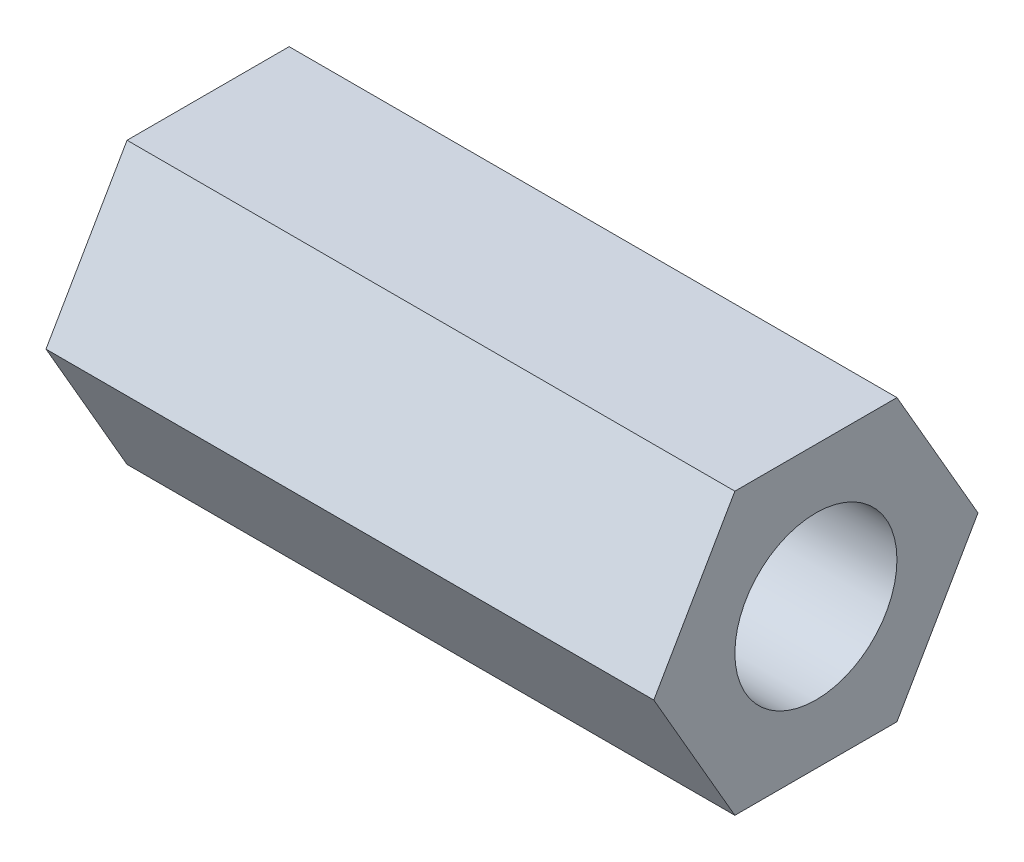
ISO-10303-21;
HEADER;
FILE_DESCRIPTION(('STEP AP214'),'2;1');
FILE_NAME('part.step','',(''),(''),'','','');
FILE_SCHEMA(('AUTOMOTIVE_DESIGN { 1 0 10303 214 1 1 1 1 }'));
ENDSEC;
DATA;
#1=APPLICATION_CONTEXT('core data for automotive mechanical design processes');
#2=APPLICATION_PROTOCOL_DEFINITION('international standard','automotive_design',2000,#1);
#3=PRODUCT_CONTEXT('',#1,'mechanical');
#4=PRODUCT('Part','Part','',(#3));
#5=PRODUCT_RELATED_PRODUCT_CATEGORY('part','',(#4));
#6=PRODUCT_DEFINITION_FORMATION('','',#4);
#7=PRODUCT_DEFINITION_CONTEXT('part definition',#1,'design');
#8=PRODUCT_DEFINITION('design','',#6,#7);
#9=PRODUCT_DEFINITION_SHAPE('','',#8);
#10=(LENGTH_UNIT() NAMED_UNIT(*) SI_UNIT(.MILLI.,.METRE.));
#11=(NAMED_UNIT(*) PLANE_ANGLE_UNIT() SI_UNIT($,.RADIAN.));
#12=(NAMED_UNIT(*) SI_UNIT($,.STERADIAN.) SOLID_ANGLE_UNIT());
#13=UNCERTAINTY_MEASURE_WITH_UNIT(LENGTH_MEASURE(1.E-05),#10,'distance_accuracy_value','');
#14=(GEOMETRIC_REPRESENTATION_CONTEXT(3) GLOBAL_UNCERTAINTY_ASSIGNED_CONTEXT((#13)) GLOBAL_UNIT_ASSIGNED_CONTEXT((#10,
#11,#12)) REPRESENTATION_CONTEXT('',''));
#15=CARTESIAN_POINT('',(0.,0.,0.));
#16=DIRECTION('',(0.,0.,1.));
#17=DIRECTION('',(1.,0.,0.));
#18=AXIS2_PLACEMENT_3D('',#15,#16,#17);
#19=CARTESIAN_POINT('',(15.,0.,0.));
#20=DIRECTION('',(1.,0.,0.));
#21=DIRECTION('',(0.,0.,-1.));
#22=AXIS2_PLACEMENT_3D('',#19,#20,#21);
#23=PLANE('',#22);
#24=DIRECTION('',(0.,-0.866025403784439,0.5));
#25=VECTOR('',#24,1.);
#26=CARTESIAN_POINT('',(15.,3.46410161513775,2.));
#27=LINE('',#26,#25);
#28=CARTESIAN_POINT('',(15.,3.46410161513775,2.));
#29=VERTEX_POINT('',#28);
#30=CARTESIAN_POINT('',(15.,0.,4.));
#31=VERTEX_POINT('',#30);
#32=EDGE_CURVE('E146',#29,#31,#27,.T.);
#33=ORIENTED_EDGE('',*,*,#32,.T.);
#34=DIRECTION('',(0.,-0.866025403784439,-0.5));
#35=VECTOR('',#34,1.);
#36=CARTESIAN_POINT('',(15.,0.,4.));
#37=LINE('',#36,#35);
#38=CARTESIAN_POINT('',(15.,-3.46410161513775,2.));
#39=VERTEX_POINT('',#38);
#40=EDGE_CURVE('E94',#31,#39,#37,.T.);
#41=ORIENTED_EDGE('',*,*,#40,.T.);
#42=DIRECTION('',(0.,0.,-1.));
#43=VECTOR('',#42,1.);
#44=CARTESIAN_POINT('',(15.,-3.46410161513775,2.));
#45=LINE('',#44,#43);
#46=CARTESIAN_POINT('',(15.,-3.46410161513775,-2.));
#47=VERTEX_POINT('',#46);
#48=EDGE_CURVE('E107',#39,#47,#45,.T.);
#49=ORIENTED_EDGE('',*,*,#48,.T.);
#50=DIRECTION('',(0.,0.866025403784439,-0.5));
#51=VECTOR('',#50,1.);
#52=CARTESIAN_POINT('',(15.,-3.46410161513775,-2.));
#53=LINE('',#52,#51);
#54=CARTESIAN_POINT('',(15.,0.,-4.));
#55=VERTEX_POINT('',#54);
#56=EDGE_CURVE('E101',#47,#55,#53,.T.);
#57=ORIENTED_EDGE('',*,*,#56,.T.);
#58=DIRECTION('',(0.,0.866025403784439,0.499999999999999));
#59=VECTOR('',#58,1.);
#60=CARTESIAN_POINT('',(15.,0.,-4.));
#61=LINE('',#60,#59);
#62=CARTESIAN_POINT('',(15.,3.46410161513775,-2.));
#63=VERTEX_POINT('',#62);
#64=EDGE_CURVE('E105',#55,#63,#61,.T.);
#65=ORIENTED_EDGE('',*,*,#64,.T.);
#66=DIRECTION('',(0.,0.,1.));
#67=VECTOR('',#66,1.);
#68=CARTESIAN_POINT('',(15.,3.46410161513775,-2.));
#69=LINE('',#68,#67);
#70=EDGE_CURVE('E57',#63,#29,#69,.T.);
#71=ORIENTED_EDGE('',*,*,#70,.T.);
#72=EDGE_LOOP('',(#33,#41,#49,#57,#65,#71));
#73=FACE_BOUND('',#72,.T.);
#74=CARTESIAN_POINT('',(15.,0.,0.));
#75=DIRECTION('',(1.,0.,0.));
#76=DIRECTION('',(0.,0.,-1.));
#77=AXIS2_PLACEMENT_3D('',#74,#75,#76);
#78=CIRCLE('',#77,2.);
#79=CARTESIAN_POINT('',(15.,0.,-2.));
#80=VERTEX_POINT('',#79);
#81=EDGE_CURVE('E134',#80,#80,#78,.T.);
#82=ORIENTED_EDGE('',*,*,#81,.F.);
#83=EDGE_LOOP('',(#82));
#84=FACE_BOUND('',#83,.T.);
#85=ADVANCED_FACE('F39',(#73,#84),#23,.T.);
#86=CARTESIAN_POINT('',(0.,0.,0.));
#87=DIRECTION('',(1.,0.,0.));
#88=DIRECTION('',(0.,0.,-1.));
#89=AXIS2_PLACEMENT_3D('',#86,#87,#88);
#90=PLANE('',#89);
#91=DIRECTION('',(0.,-0.866025403784439,0.5));
#92=VECTOR('',#91,1.);
#93=CARTESIAN_POINT('',(0.,3.46410161513775,2.));
#94=LINE('',#93,#92);
#95=CARTESIAN_POINT('',(0.,3.46410161513775,2.));
#96=VERTEX_POINT('',#95);
#97=CARTESIAN_POINT('',(0.,0.,4.));
#98=VERTEX_POINT('',#97);
#99=EDGE_CURVE('E129',#96,#98,#94,.T.);
#100=ORIENTED_EDGE('',*,*,#99,.F.);
#101=DIRECTION('',(0.,0.,1.));
#102=VECTOR('',#101,1.);
#103=CARTESIAN_POINT('',(0.,3.46410161513775,-2.));
#104=LINE('',#103,#102);
#105=CARTESIAN_POINT('',(0.,3.46410161513775,-2.));
#106=VERTEX_POINT('',#105);
#107=EDGE_CURVE('E86',#106,#96,#104,.T.);
#108=ORIENTED_EDGE('',*,*,#107,.F.);
#109=DIRECTION('',(0.,0.866025403784439,0.499999999999999));
#110=VECTOR('',#109,1.);
#111=CARTESIAN_POINT('',(0.,0.,-4.));
#112=LINE('',#111,#110);
#113=CARTESIAN_POINT('',(0.,0.,-4.));
#114=VERTEX_POINT('',#113);
#115=EDGE_CURVE('E80',#114,#106,#112,.T.);
#116=ORIENTED_EDGE('',*,*,#115,.F.);
#117=DIRECTION('',(0.,0.866025403784439,-0.5));
#118=VECTOR('',#117,1.);
#119=CARTESIAN_POINT('',(0.,-3.46410161513775,-2.));
#120=LINE('',#119,#118);
#121=CARTESIAN_POINT('',(0.,-3.46410161513775,-2.));
#122=VERTEX_POINT('',#121);
#123=EDGE_CURVE('E116',#122,#114,#120,.T.);
#124=ORIENTED_EDGE('',*,*,#123,.F.);
#125=DIRECTION('',(0.,0.,-1.));
#126=VECTOR('',#125,1.);
#127=CARTESIAN_POINT('',(0.,-3.46410161513775,2.));
#128=LINE('',#127,#126);
#129=CARTESIAN_POINT('',(0.,-3.46410161513775,2.));
#130=VERTEX_POINT('',#129);
#131=EDGE_CURVE('E137',#130,#122,#128,.T.);
#132=ORIENTED_EDGE('',*,*,#131,.F.);
#133=DIRECTION('',(0.,-0.866025403784439,-0.5));
#134=VECTOR('',#133,1.);
#135=CARTESIAN_POINT('',(0.,0.,4.));
#136=LINE('',#135,#134);
#137=EDGE_CURVE('E133',#98,#130,#136,.T.);
#138=ORIENTED_EDGE('',*,*,#137,.F.);
#139=EDGE_LOOP('',(#100,#108,#116,#124,#132,#138));
#140=FACE_BOUND('',#139,.T.);
#141=CARTESIAN_POINT('',(0.,0.,0.));
#142=DIRECTION('',(1.,0.,0.));
#143=DIRECTION('',(0.,0.,-1.));
#144=AXIS2_PLACEMENT_3D('',#141,#142,#143);
#145=CIRCLE('',#144,2.);
#146=CARTESIAN_POINT('',(0.,0.,-2.));
#147=VERTEX_POINT('',#146);
#148=EDGE_CURVE('E243',#147,#147,#145,.T.);
#149=ORIENTED_EDGE('',*,*,#148,.T.);
#150=EDGE_LOOP('',(#149));
#151=FACE_BOUND('',#150,.T.);
#152=ADVANCED_FACE('F159',(#140,#151),#90,.F.);
#153=CARTESIAN_POINT('',(15.,3.46410161513775,2.));
#154=DIRECTION('',(0.,-0.5,-0.866025403784439));
#155=DIRECTION('',(0.,0.866025403784439,-0.5));
#156=AXIS2_PLACEMENT_3D('',#153,#154,#155);
#157=PLANE('',#156);
#158=ORIENTED_EDGE('',*,*,#99,.T.);
#159=DIRECTION('',(-1.,0.,0.));
#160=VECTOR('',#159,1.);
#161=CARTESIAN_POINT('',(15.,0.,4.));
#162=LINE('',#161,#160);
#163=EDGE_CURVE('E11',#31,#98,#162,.T.);
#164=ORIENTED_EDGE('',*,*,#163,.F.);
#165=ORIENTED_EDGE('',*,*,#32,.F.);
#166=DIRECTION('',(-1.,0.,0.));
#167=VECTOR('',#166,1.);
#168=CARTESIAN_POINT('',(15.,3.46410161513775,2.));
#169=LINE('',#168,#167);
#170=EDGE_CURVE('E125',#29,#96,#169,.T.);
#171=ORIENTED_EDGE('',*,*,#170,.T.);
#172=EDGE_LOOP('',(#158,#164,#165,#171));
#173=FACE_BOUND('',#172,.T.);
#174=ADVANCED_FACE('F41',(#173),#157,.F.);
#175=CARTESIAN_POINT('',(15.,0.,4.));
#176=DIRECTION('',(0.,0.5,-0.866025403784439));
#177=DIRECTION('',(0.,0.866025403784439,0.5));
#178=AXIS2_PLACEMENT_3D('',#175,#176,#177);
#179=PLANE('',#178);
#180=ORIENTED_EDGE('',*,*,#137,.T.);
#181=DIRECTION('',(-1.,0.,0.));
#182=VECTOR('',#181,1.);
#183=CARTESIAN_POINT('',(15.,-3.46410161513775,2.));
#184=LINE('',#183,#182);
#185=EDGE_CURVE('E49',#39,#130,#184,.T.);
#186=ORIENTED_EDGE('',*,*,#185,.F.);
#187=ORIENTED_EDGE('',*,*,#40,.F.);
#188=ORIENTED_EDGE('',*,*,#163,.T.);
#189=EDGE_LOOP('',(#180,#186,#187,#188));
#190=FACE_BOUND('',#189,.T.);
#191=ADVANCED_FACE('F184',(#190),#179,.F.);
#192=CARTESIAN_POINT('',(15.,-3.46410161513775,2.));
#193=DIRECTION('',(0.,1.,0.));
#194=DIRECTION('',(0.,0.,1.));
#195=AXIS2_PLACEMENT_3D('',#192,#193,#194);
#196=PLANE('',#195);
#197=ORIENTED_EDGE('',*,*,#131,.T.);
#198=DIRECTION('',(-1.,0.,0.));
#199=VECTOR('',#198,1.);
#200=CARTESIAN_POINT('',(15.,-3.46410161513775,-2.));
#201=LINE('',#200,#199);
#202=EDGE_CURVE('E118',#47,#122,#201,.T.);
#203=ORIENTED_EDGE('',*,*,#202,.F.);
#204=ORIENTED_EDGE('',*,*,#48,.F.);
#205=ORIENTED_EDGE('',*,*,#185,.T.);
#206=EDGE_LOOP('',(#197,#203,#204,#205));
#207=FACE_BOUND('',#206,.T.);
#208=ADVANCED_FACE('F156',(#207),#196,.F.);
#209=CARTESIAN_POINT('',(15.,-3.46410161513775,-2.));
#210=DIRECTION('',(0.,0.5,0.866025403784438));
#211=DIRECTION('',(0.,-0.866025403784439,0.5));
#212=AXIS2_PLACEMENT_3D('',#209,#210,#211);
#213=PLANE('',#212);
#214=ORIENTED_EDGE('',*,*,#123,.T.);
#215=DIRECTION('',(-1.,0.,0.));
#216=VECTOR('',#215,1.);
#217=CARTESIAN_POINT('',(15.,0.,-4.));
#218=LINE('',#217,#216);
#219=EDGE_CURVE('E113',#55,#114,#218,.T.);
#220=ORIENTED_EDGE('',*,*,#219,.F.);
#221=ORIENTED_EDGE('',*,*,#56,.F.);
#222=ORIENTED_EDGE('',*,*,#202,.T.);
#223=EDGE_LOOP('',(#214,#220,#221,#222));
#224=FACE_BOUND('',#223,.T.);
#225=ADVANCED_FACE('F114',(#224),#213,.F.);
#226=CARTESIAN_POINT('',(15.,0.,-4.));
#227=DIRECTION('',(0.,-0.499999999999999,0.866025403784439));
#228=DIRECTION('',(0.,-0.866025403784439,-0.5));
#229=AXIS2_PLACEMENT_3D('',#226,#227,#228);
#230=PLANE('',#229);
#231=ORIENTED_EDGE('',*,*,#115,.T.);
#232=DIRECTION('',(-1.,0.,0.));
#233=VECTOR('',#232,1.);
#234=CARTESIAN_POINT('',(15.,3.46410161513775,-2.));
#235=LINE('',#234,#233);
#236=EDGE_CURVE('E119',#63,#106,#235,.T.);
#237=ORIENTED_EDGE('',*,*,#236,.F.);
#238=ORIENTED_EDGE('',*,*,#64,.F.);
#239=ORIENTED_EDGE('',*,*,#219,.T.);
#240=EDGE_LOOP('',(#231,#237,#238,#239));
#241=FACE_BOUND('',#240,.T.);
#242=ADVANCED_FACE('F121',(#241),#230,.F.);
#243=CARTESIAN_POINT('',(15.,3.46410161513775,-2.));
#244=DIRECTION('',(0.,-1.,0.));
#245=DIRECTION('',(0.,0.,-1.));
#246=AXIS2_PLACEMENT_3D('',#243,#244,#245);
#247=PLANE('',#246);
#248=ORIENTED_EDGE('',*,*,#107,.T.);
#249=ORIENTED_EDGE('',*,*,#170,.F.);
#250=ORIENTED_EDGE('',*,*,#70,.F.);
#251=ORIENTED_EDGE('',*,*,#236,.T.);
#252=EDGE_LOOP('',(#248,#249,#250,#251));
#253=FACE_BOUND('',#252,.T.);
#254=ADVANCED_FACE('F164',(#253),#247,.F.);
#255=CARTESIAN_POINT('',(15.,0.,0.));
#256=DIRECTION('',(-1.,0.,0.));
#257=DIRECTION('',(0.,0.,1.));
#258=AXIS2_PLACEMENT_3D('',#255,#256,#257);
#259=CYLINDRICAL_SURFACE('',#258,2.);
#260=ORIENTED_EDGE('',*,*,#81,.T.);
#261=EDGE_LOOP('',(#260));
#262=FACE_BOUND('',#261,.T.);
#263=ORIENTED_EDGE('',*,*,#148,.F.);
#264=EDGE_LOOP('',(#263));
#265=FACE_BOUND('',#264,.T.);
#266=ADVANCED_FACE('F166',(#262,#265),#259,.F.);
#267=CLOSED_SHELL('',(#85,#152,#174,#191,#208,#225,#242,#254,#266));
#268=MANIFOLD_SOLID_BREP('B2',#267);
#269=ADVANCED_BREP_SHAPE_REPRESENTATION('',(#18,#268),#14);
#270=SHAPE_DEFINITION_REPRESENTATION(#9,#269);
ENDSEC;
END-ISO-10303-21;
